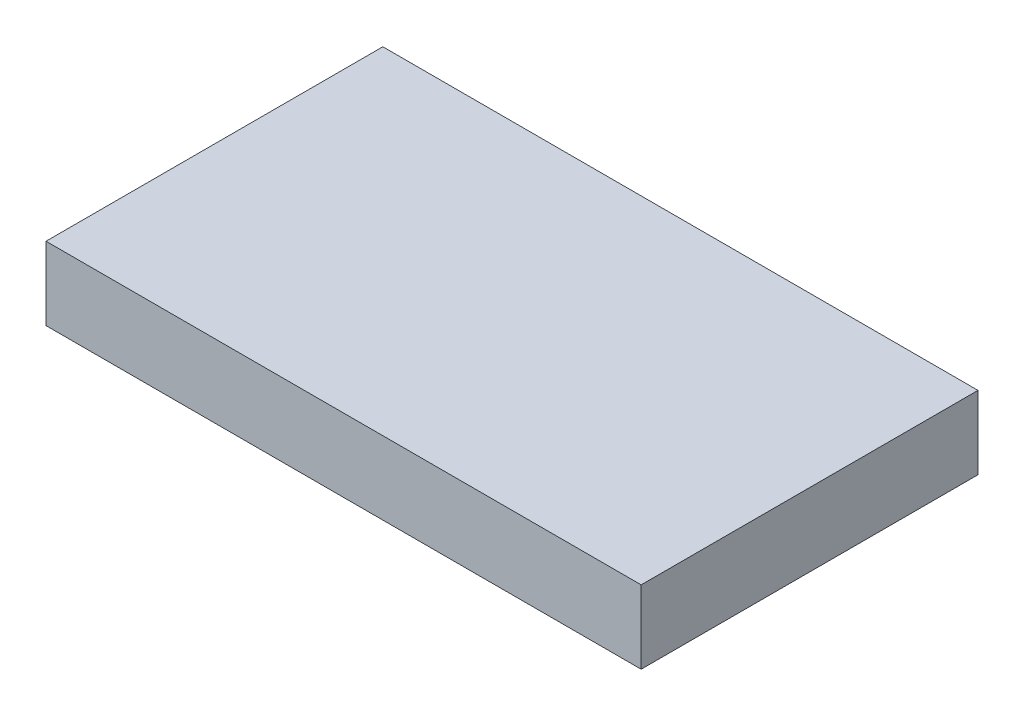
ISO-10303-21;
HEADER;
FILE_DESCRIPTION(('STEP AP214'),'2;1');
FILE_NAME('part.step','',(''),(''),'','','');
FILE_SCHEMA(('AUTOMOTIVE_DESIGN { 1 0 10303 214 1 1 1 1 }'));
ENDSEC;
DATA;
#1=APPLICATION_CONTEXT('core data for automotive mechanical design processes');
#2=APPLICATION_PROTOCOL_DEFINITION('international standard','automotive_design',2000,#1);
#3=PRODUCT_CONTEXT('',#1,'mechanical');
#4=PRODUCT('Part','Part','',(#3));
#5=PRODUCT_RELATED_PRODUCT_CATEGORY('part','',(#4));
#6=PRODUCT_DEFINITION_FORMATION('','',#4);
#7=PRODUCT_DEFINITION_CONTEXT('part definition',#1,'design');
#8=PRODUCT_DEFINITION('design','',#6,#7);
#9=PRODUCT_DEFINITION_SHAPE('','',#8);
#10=(LENGTH_UNIT() NAMED_UNIT(*) SI_UNIT(.MILLI.,.METRE.));
#11=(NAMED_UNIT(*) PLANE_ANGLE_UNIT() SI_UNIT($,.RADIAN.));
#12=(NAMED_UNIT(*) SI_UNIT($,.STERADIAN.) SOLID_ANGLE_UNIT());
#13=UNCERTAINTY_MEASURE_WITH_UNIT(LENGTH_MEASURE(1.E-05),#10,'distance_accuracy_value','');
#14=(GEOMETRIC_REPRESENTATION_CONTEXT(3) GLOBAL_UNCERTAINTY_ASSIGNED_CONTEXT((#13)) GLOBAL_UNIT_ASSIGNED_CONTEXT((#10,
#11,#12)) REPRESENTATION_CONTEXT('',''));
#15=CARTESIAN_POINT('',(0.,0.,0.));
#16=DIRECTION('',(0.,0.,1.));
#17=DIRECTION('',(1.,0.,0.));
#18=AXIS2_PLACEMENT_3D('',#15,#16,#17);
#19=CARTESIAN_POINT('',(-241.,59.2,136.4));
#20=DIRECTION('',(1.,0.,0.));
#21=DIRECTION('',(0.,0.,-1.));
#22=AXIS2_PLACEMENT_3D('',#19,#20,#21);
#23=PLANE('',#22);
#24=DIRECTION('',(0.,0.,1.));
#25=VECTOR('',#24,1.);
#26=CARTESIAN_POINT('',(-241.,0.,136.4));
#27=LINE('',#26,#25);
#28=CARTESIAN_POINT('',(-241.,0.,-136.4));
#29=VERTEX_POINT('',#28);
#30=CARTESIAN_POINT('',(-241.,0.,136.4));
#31=VERTEX_POINT('',#30);
#32=EDGE_CURVE('E102',#29,#31,#27,.T.);
#33=ORIENTED_EDGE('',*,*,#32,.T.);
#34=DIRECTION('',(0.,-1.,0.));
#35=VECTOR('',#34,1.);
#36=CARTESIAN_POINT('',(-241.,59.2,136.4));
#37=LINE('',#36,#35);
#38=CARTESIAN_POINT('',(-241.,59.2,136.4));
#39=VERTEX_POINT('',#38);
#40=EDGE_CURVE('E11',#39,#31,#37,.T.);
#41=ORIENTED_EDGE('',*,*,#40,.F.);
#42=DIRECTION('',(0.,0.,1.));
#43=VECTOR('',#42,1.);
#44=CARTESIAN_POINT('',(-241.,59.2,136.4));
#45=LINE('',#44,#43);
#46=CARTESIAN_POINT('',(-241.,59.2,-136.4));
#47=VERTEX_POINT('',#46);
#48=EDGE_CURVE('E90',#47,#39,#45,.T.);
#49=ORIENTED_EDGE('',*,*,#48,.F.);
#50=DIRECTION('',(0.,-1.,0.));
#51=VECTOR('',#50,1.);
#52=CARTESIAN_POINT('',(-241.,59.2,-136.4));
#53=LINE('',#52,#51);
#54=EDGE_CURVE('E98',#47,#29,#53,.T.);
#55=ORIENTED_EDGE('',*,*,#54,.T.);
#56=EDGE_LOOP('',(#33,#41,#49,#55));
#57=FACE_BOUND('',#56,.T.);
#58=ADVANCED_FACE('F39',(#57),#23,.F.);
#59=CARTESIAN_POINT('',(241.,59.2,136.4));
#60=DIRECTION('',(0.,0.,-1.));
#61=DIRECTION('',(-1.,0.,0.));
#62=AXIS2_PLACEMENT_3D('',#59,#60,#61);
#63=PLANE('',#62);
#64=DIRECTION('',(1.,0.,0.));
#65=VECTOR('',#64,1.);
#66=CARTESIAN_POINT('',(241.,0.,136.4));
#67=LINE('',#66,#65);
#68=CARTESIAN_POINT('',(241.,0.,136.4));
#69=VERTEX_POINT('',#68);
#70=EDGE_CURVE('E94',#31,#69,#67,.T.);
#71=ORIENTED_EDGE('',*,*,#70,.T.);
#72=DIRECTION('',(0.,-1.,0.));
#73=VECTOR('',#72,1.);
#74=CARTESIAN_POINT('',(241.,59.2,136.4));
#75=LINE('',#74,#73);
#76=CARTESIAN_POINT('',(241.,59.2,136.4));
#77=VERTEX_POINT('',#76);
#78=EDGE_CURVE('E47',#77,#69,#75,.T.);
#79=ORIENTED_EDGE('',*,*,#78,.F.);
#80=DIRECTION('',(1.,0.,0.));
#81=VECTOR('',#80,1.);
#82=CARTESIAN_POINT('',(241.,59.2,136.4));
#83=LINE('',#82,#81);
#84=EDGE_CURVE('E85',#39,#77,#83,.T.);
#85=ORIENTED_EDGE('',*,*,#84,.F.);
#86=ORIENTED_EDGE('',*,*,#40,.T.);
#87=EDGE_LOOP('',(#71,#79,#85,#86));
#88=FACE_BOUND('',#87,.T.);
#89=ADVANCED_FACE('F93',(#88),#63,.F.);
#90=CARTESIAN_POINT('',(241.,59.2,136.4));
#91=DIRECTION('',(-1.,0.,0.));
#92=DIRECTION('',(0.,0.,1.));
#93=AXIS2_PLACEMENT_3D('',#90,#91,#92);
#94=PLANE('',#93);
#95=DIRECTION('',(0.,0.,-1.));
#96=VECTOR('',#95,1.);
#97=CARTESIAN_POINT('',(241.,0.,136.4));
#98=LINE('',#97,#96);
#99=CARTESIAN_POINT('',(241.,0.,-136.4));
#100=VERTEX_POINT('',#99);
#101=EDGE_CURVE('E72',#69,#100,#98,.T.);
#102=ORIENTED_EDGE('',*,*,#101,.T.);
#103=DIRECTION('',(0.,-1.,0.));
#104=VECTOR('',#103,1.);
#105=CARTESIAN_POINT('',(241.,59.2,-136.4));
#106=LINE('',#105,#104);
#107=CARTESIAN_POINT('',(241.,59.2,-136.4));
#108=VERTEX_POINT('',#107);
#109=EDGE_CURVE('E95',#108,#100,#106,.T.);
#110=ORIENTED_EDGE('',*,*,#109,.F.);
#111=DIRECTION('',(0.,0.,-1.));
#112=VECTOR('',#111,1.);
#113=CARTESIAN_POINT('',(241.,59.2,136.4));
#114=LINE('',#113,#112);
#115=EDGE_CURVE('E88',#77,#108,#114,.T.);
#116=ORIENTED_EDGE('',*,*,#115,.F.);
#117=ORIENTED_EDGE('',*,*,#78,.T.);
#118=EDGE_LOOP('',(#102,#110,#116,#117));
#119=FACE_BOUND('',#118,.T.);
#120=ADVANCED_FACE('F96',(#119),#94,.F.);
#121=CARTESIAN_POINT('',(241.,59.2,-136.4));
#122=DIRECTION('',(0.,0.,1.));
#123=DIRECTION('',(1.,0.,0.));
#124=AXIS2_PLACEMENT_3D('',#121,#122,#123);
#125=PLANE('',#124);
#126=DIRECTION('',(-1.,0.,0.));
#127=VECTOR('',#126,1.);
#128=CARTESIAN_POINT('',(241.,0.,-136.4));
#129=LINE('',#128,#127);
#130=EDGE_CURVE('E78',#100,#29,#129,.T.);
#131=ORIENTED_EDGE('',*,*,#130,.T.);
#132=ORIENTED_EDGE('',*,*,#54,.F.);
#133=DIRECTION('',(-1.,0.,0.));
#134=VECTOR('',#133,1.);
#135=CARTESIAN_POINT('',(241.,59.2,-136.4));
#136=LINE('',#135,#134);
#137=EDGE_CURVE('E55',#108,#47,#136,.T.);
#138=ORIENTED_EDGE('',*,*,#137,.F.);
#139=ORIENTED_EDGE('',*,*,#109,.T.);
#140=EDGE_LOOP('',(#131,#132,#138,#139));
#141=FACE_BOUND('',#140,.T.);
#142=ADVANCED_FACE('F109',(#141),#125,.F.);
#143=CARTESIAN_POINT('',(0.,59.2,0.));
#144=DIRECTION('',(0.,1.,0.));
#145=DIRECTION('',(0.,0.,1.));
#146=AXIS2_PLACEMENT_3D('',#143,#144,#145);
#147=PLANE('',#146);
#148=ORIENTED_EDGE('',*,*,#48,.T.);
#149=ORIENTED_EDGE('',*,*,#84,.T.);
#150=ORIENTED_EDGE('',*,*,#115,.T.);
#151=ORIENTED_EDGE('',*,*,#137,.T.);
#152=EDGE_LOOP('',(#148,#149,#150,#151));
#153=FACE_BOUND('',#152,.T.);
#154=ADVANCED_FACE('F86',(#153),#147,.T.);
#155=CARTESIAN_POINT('',(0.,0.,0.));
#156=DIRECTION('',(0.,1.,0.));
#157=DIRECTION('',(0.,0.,1.));
#158=AXIS2_PLACEMENT_3D('',#155,#156,#157);
#159=PLANE('',#158);
#160=ORIENTED_EDGE('',*,*,#32,.F.);
#161=ORIENTED_EDGE('',*,*,#130,.F.);
#162=ORIENTED_EDGE('',*,*,#101,.F.);
#163=ORIENTED_EDGE('',*,*,#70,.F.);
#164=EDGE_LOOP('',(#160,#161,#162,#163));
#165=FACE_BOUND('',#164,.T.);
#166=ADVANCED_FACE('F112',(#165),#159,.F.);
#167=CLOSED_SHELL('',(#58,#89,#120,#142,#154,#166));
#168=MANIFOLD_SOLID_BREP('B2',#167);
#169=ADVANCED_BREP_SHAPE_REPRESENTATION('',(#18,#168),#14);
#170=SHAPE_DEFINITION_REPRESENTATION(#9,#169);
ENDSEC;
END-ISO-10303-21;
